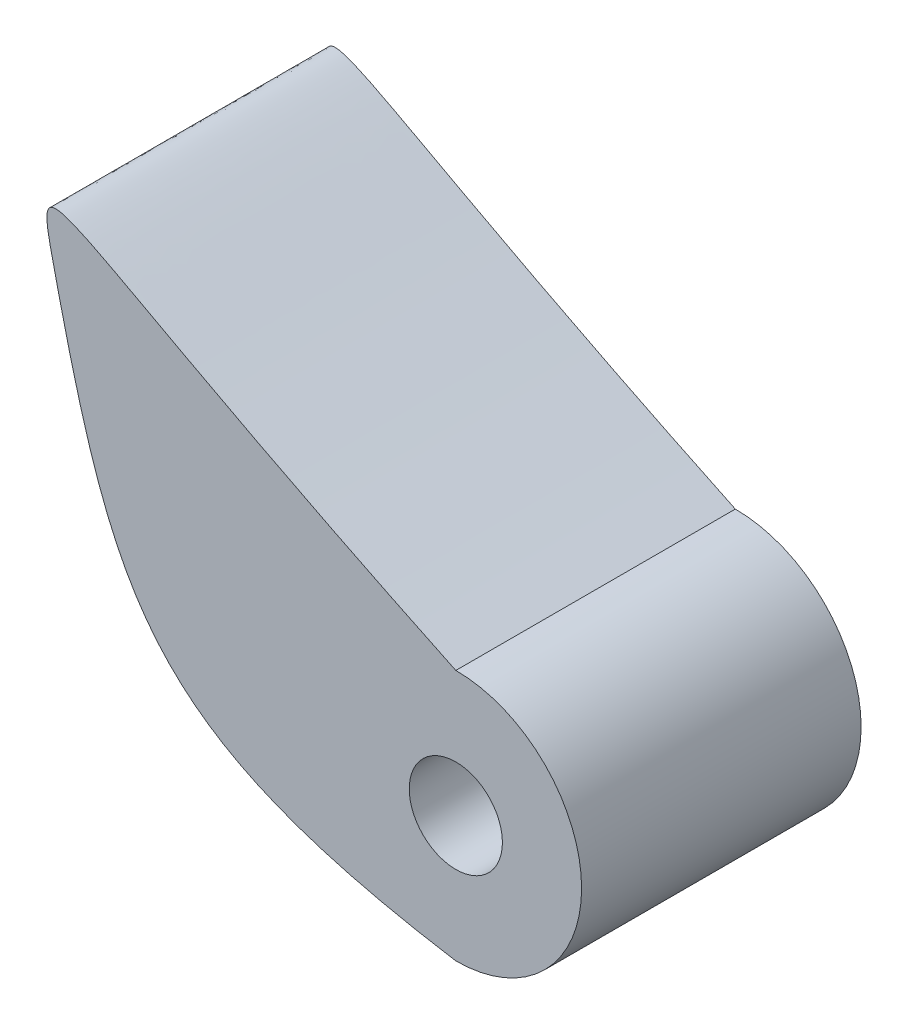
ISO-10303-21;
HEADER;
FILE_DESCRIPTION(('STEP AP214'),'2;1');
FILE_NAME('part.step','',(''),(''),'','','');
FILE_SCHEMA(('AUTOMOTIVE_DESIGN { 1 0 10303 214 1 1 1 1 }'));
ENDSEC;
DATA;
#1=APPLICATION_CONTEXT('core data for automotive mechanical design processes');
#2=APPLICATION_PROTOCOL_DEFINITION('international standard','automotive_design',2000,#1);
#3=PRODUCT_CONTEXT('',#1,'mechanical');
#4=PRODUCT('Part','Part','',(#3));
#5=PRODUCT_RELATED_PRODUCT_CATEGORY('part','',(#4));
#6=PRODUCT_DEFINITION_FORMATION('','',#4);
#7=PRODUCT_DEFINITION_CONTEXT('part definition',#1,'design');
#8=PRODUCT_DEFINITION('design','',#6,#7);
#9=PRODUCT_DEFINITION_SHAPE('','',#8);
#10=(LENGTH_UNIT() NAMED_UNIT(*) SI_UNIT(.MILLI.,.METRE.));
#11=(NAMED_UNIT(*) PLANE_ANGLE_UNIT() SI_UNIT($,.RADIAN.));
#12=(NAMED_UNIT(*) SI_UNIT($,.STERADIAN.) SOLID_ANGLE_UNIT());
#13=UNCERTAINTY_MEASURE_WITH_UNIT(LENGTH_MEASURE(1.E-05),#10,'distance_accuracy_value','');
#14=(GEOMETRIC_REPRESENTATION_CONTEXT(3) GLOBAL_UNCERTAINTY_ASSIGNED_CONTEXT((#13)) GLOBAL_UNIT_ASSIGNED_CONTEXT((#10,
#11,#12)) REPRESENTATION_CONTEXT('',''));
#15=CARTESIAN_POINT('',(0.,0.,0.));
#16=DIRECTION('',(0.,0.,1.));
#17=DIRECTION('',(1.,0.,0.));
#18=AXIS2_PLACEMENT_3D('',#15,#16,#17);
#19=CARTESIAN_POINT('',(0.,-6.75,-15.));
#20=CARTESIAN_POINT('',(-12.8410874560347,-4.66484879323894,-15.));
#21=CARTESIAN_POINT('',(-18.2183744386455,0.101610435845555,-15.));
#22=CARTESIAN_POINT('',(-23.1139041146912,21.4668311955079,-15.));
#23=CARTESIAN_POINT('',(-22.1620828051884,17.286541146133,-15.));
#24=CARTESIAN_POINT('',(0.,6.75,-15.));
#25=B_SPLINE_CURVE_WITH_KNOTS('',3,(#19,#20,#21,#22,#23,#24),.UNSPECIFIED.,.F.,.F.,(4,1,1,4),
(0.,0.428893749792263,0.581534400068823,1.),.UNSPECIFIED.);
#26=DIRECTION('',(0.,0.,1.));
#27=VECTOR('',#26,1.);
#28=SURFACE_OF_LINEAR_EXTRUSION('',#25,#27);
#29=CARTESIAN_POINT('',(0.,-6.75,0.));
#30=CARTESIAN_POINT('',(-12.8410874560347,-4.66484879323894,0.));
#31=CARTESIAN_POINT('',(-18.2183744386455,0.101610435845555,0.));
#32=CARTESIAN_POINT('',(-23.1139041146912,21.4668311955079,0.));
#33=CARTESIAN_POINT('',(-22.1620828051884,17.286541146133,0.));
#34=CARTESIAN_POINT('',(0.,6.75,0.));
#35=B_SPLINE_CURVE_WITH_KNOTS('',3,(#29,#30,#31,#32,#33,#34),.UNSPECIFIED.,.F.,.F.,(4,1,1,4),
(0.,0.428893749792263,0.581534400068823,1.),.UNSPECIFIED.);
#36=CARTESIAN_POINT('',(0.,-6.75,0.));
#37=VERTEX_POINT('',#36);
#38=CARTESIAN_POINT('',(0.,6.75,0.));
#39=VERTEX_POINT('',#38);
#40=EDGE_CURVE('E78',#37,#39,#35,.T.);
#41=ORIENTED_EDGE('',*,*,#40,.T.);
#42=DIRECTION('',(0.,0.,1.));
#43=VECTOR('',#42,1.);
#44=CARTESIAN_POINT('',(0.,6.75,-15.));
#45=LINE('',#44,#43);
#46=CARTESIAN_POINT('',(0.,6.75,-15.));
#47=VERTEX_POINT('',#46);
#48=EDGE_CURVE('E11',#47,#39,#45,.T.);
#49=ORIENTED_EDGE('',*,*,#48,.F.);
#50=CARTESIAN_POINT('',(0.,-6.75,-15.));
#51=VERTEX_POINT('',#50);
#52=EDGE_CURVE('E62',#51,#47,#25,.T.);
#53=ORIENTED_EDGE('',*,*,#52,.F.);
#54=DIRECTION('',(0.,0.,1.));
#55=VECTOR('',#54,1.);
#56=CARTESIAN_POINT('',(0.,-6.75,-15.));
#57=LINE('',#56,#55);
#58=EDGE_CURVE('E49',#51,#37,#57,.T.);
#59=ORIENTED_EDGE('',*,*,#58,.T.);
#60=EDGE_LOOP('',(#41,#49,#53,#59));
#61=FACE_BOUND('',#60,.T.);
#62=ADVANCED_FACE('F45',(#61),#28,.F.);
#63=CARTESIAN_POINT('',(0.,0.,-15.));
#64=DIRECTION('',(0.,0.,1.));
#65=DIRECTION('',(1.,0.,0.));
#66=AXIS2_PLACEMENT_3D('',#63,#64,#65);
#67=CYLINDRICAL_SURFACE('',#66,6.75);
#68=CARTESIAN_POINT('',(0.,0.,0.));
#69=DIRECTION('',(0.,0.,1.));
#70=DIRECTION('',(1.,0.,0.));
#71=AXIS2_PLACEMENT_3D('',#68,#69,#70);
#72=CIRCLE('',#71,6.75);
#73=EDGE_CURVE('E76',#37,#39,#72,.T.);
#74=ORIENTED_EDGE('',*,*,#73,.F.);
#75=ORIENTED_EDGE('',*,*,#58,.F.);
#76=CARTESIAN_POINT('',(0.,0.,-15.));
#77=DIRECTION('',(0.,0.,1.));
#78=DIRECTION('',(1.,0.,0.));
#79=AXIS2_PLACEMENT_3D('',#76,#77,#78);
#80=CIRCLE('',#79,6.75);
#81=EDGE_CURVE('E77',#51,#47,#80,.T.);
#82=ORIENTED_EDGE('',*,*,#81,.T.);
#83=ORIENTED_EDGE('',*,*,#48,.T.);
#84=EDGE_LOOP('',(#74,#75,#82,#83));
#85=FACE_BOUND('',#84,.T.);
#86=ADVANCED_FACE('F74',(#85),#67,.T.);
#87=CARTESIAN_POINT('',(0.,0.,-15.));
#88=DIRECTION('',(0.,0.,1.));
#89=DIRECTION('',(1.,0.,0.));
#90=AXIS2_PLACEMENT_3D('',#87,#88,#89);
#91=CYLINDRICAL_SURFACE('',#90,2.5);
#92=CARTESIAN_POINT('',(0.,0.,-15.));
#93=DIRECTION('',(0.,0.,1.));
#94=DIRECTION('',(1.,0.,0.));
#95=AXIS2_PLACEMENT_3D('',#92,#93,#94);
#96=CIRCLE('',#95,2.5);
#97=CARTESIAN_POINT('',(2.5,0.,-15.));
#98=VERTEX_POINT('',#97);
#99=EDGE_CURVE('E93',#98,#98,#96,.T.);
#100=ORIENTED_EDGE('',*,*,#99,.F.);
#101=EDGE_LOOP('',(#100));
#102=FACE_BOUND('',#101,.T.);
#103=CARTESIAN_POINT('',(0.,0.,0.));
#104=DIRECTION('',(0.,0.,1.));
#105=DIRECTION('',(1.,0.,0.));
#106=AXIS2_PLACEMENT_3D('',#103,#104,#105);
#107=CIRCLE('',#106,2.5);
#108=CARTESIAN_POINT('',(2.5,0.,0.));
#109=VERTEX_POINT('',#108);
#110=EDGE_CURVE('E85',#109,#109,#107,.T.);
#111=ORIENTED_EDGE('',*,*,#110,.T.);
#112=EDGE_LOOP('',(#111));
#113=FACE_BOUND('',#112,.T.);
#114=ADVANCED_FACE('F113',(#102,#113),#91,.F.);
#115=CARTESIAN_POINT('',(0.,0.,-15.));
#116=DIRECTION('',(0.,0.,1.));
#117=DIRECTION('',(1.,0.,0.));
#118=AXIS2_PLACEMENT_3D('',#115,#116,#117);
#119=PLANE('',#118);
#120=ORIENTED_EDGE('',*,*,#52,.T.);
#121=ORIENTED_EDGE('',*,*,#81,.F.);
#122=EDGE_LOOP('',(#120,#121));
#123=FACE_BOUND('',#122,.T.);
#124=ORIENTED_EDGE('',*,*,#99,.T.);
#125=EDGE_LOOP('',(#124));
#126=FACE_BOUND('',#125,.T.);
#127=ADVANCED_FACE('F111',(#123,#126),#119,.F.);
#128=CARTESIAN_POINT('',(0.,0.,0.));
#129=DIRECTION('',(0.,0.,1.));
#130=DIRECTION('',(1.,0.,0.));
#131=AXIS2_PLACEMENT_3D('',#128,#129,#130);
#132=PLANE('',#131);
#133=ORIENTED_EDGE('',*,*,#40,.F.);
#134=ORIENTED_EDGE('',*,*,#73,.T.);
#135=EDGE_LOOP('',(#133,#134));
#136=FACE_BOUND('',#135,.T.);
#137=ORIENTED_EDGE('',*,*,#110,.F.);
#138=EDGE_LOOP('',(#137));
#139=FACE_BOUND('',#138,.T.);
#140=ADVANCED_FACE('F82',(#136,#139),#132,.T.);
#141=CLOSED_SHELL('',(#62,#86,#114,#127,#140));
#142=MANIFOLD_SOLID_BREP('B2',#141);
#143=ADVANCED_BREP_SHAPE_REPRESENTATION('',(#18,#142),#14);
#144=SHAPE_DEFINITION_REPRESENTATION(#9,#143);
ENDSEC;
END-ISO-10303-21;
